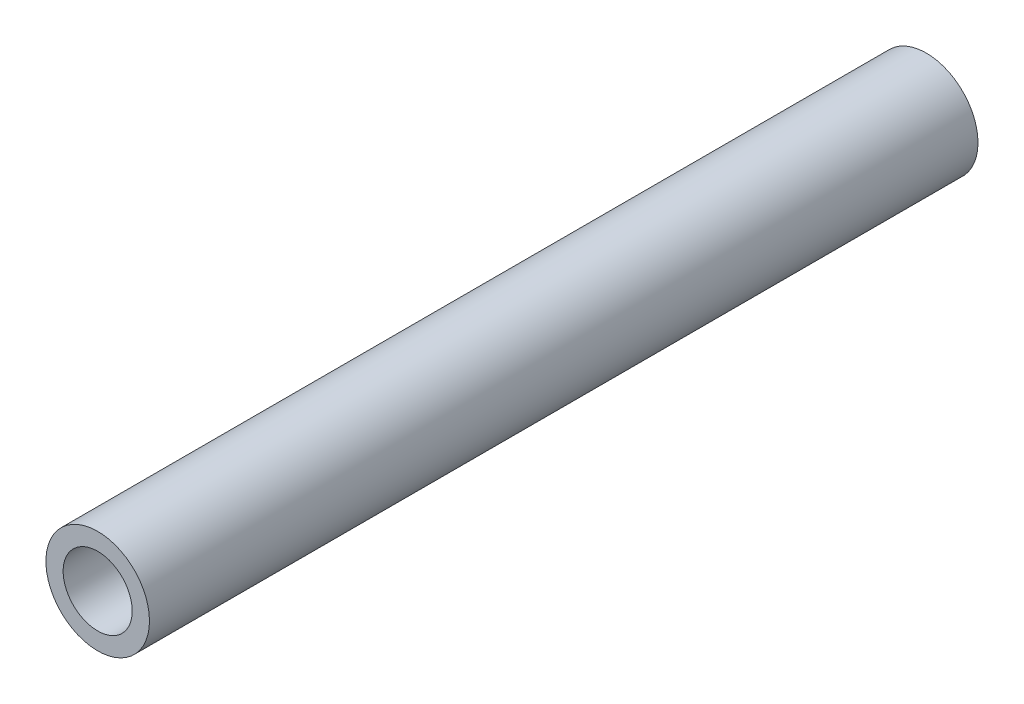
ISO-10303-21;
HEADER;
FILE_DESCRIPTION(('STEP AP214'),'2;1');
FILE_NAME('part.step','',(''),(''),'','','');
FILE_SCHEMA(('AUTOMOTIVE_DESIGN { 1 0 10303 214 1 1 1 1 }'));
ENDSEC;
DATA;
#1=APPLICATION_CONTEXT('core data for automotive mechanical design processes');
#2=APPLICATION_PROTOCOL_DEFINITION('international standard','automotive_design',2000,#1);
#3=PRODUCT_CONTEXT('',#1,'mechanical');
#4=PRODUCT('Part','Part','',(#3));
#5=PRODUCT_RELATED_PRODUCT_CATEGORY('part','',(#4));
#6=PRODUCT_DEFINITION_FORMATION('','',#4);
#7=PRODUCT_DEFINITION_CONTEXT('part definition',#1,'design');
#8=PRODUCT_DEFINITION('design','',#6,#7);
#9=PRODUCT_DEFINITION_SHAPE('','',#8);
#10=(LENGTH_UNIT() NAMED_UNIT(*) SI_UNIT(.MILLI.,.METRE.));
#11=(NAMED_UNIT(*) PLANE_ANGLE_UNIT() SI_UNIT($,.RADIAN.));
#12=(NAMED_UNIT(*) SI_UNIT($,.STERADIAN.) SOLID_ANGLE_UNIT());
#13=UNCERTAINTY_MEASURE_WITH_UNIT(LENGTH_MEASURE(1.E-05),#10,'distance_accuracy_value','');
#14=(GEOMETRIC_REPRESENTATION_CONTEXT(3) GLOBAL_UNCERTAINTY_ASSIGNED_CONTEXT((#13)) GLOBAL_UNIT_ASSIGNED_CONTEXT((#10,
#11,#12)) REPRESENTATION_CONTEXT('',''));
#15=CARTESIAN_POINT('',(0.,0.,0.));
#16=DIRECTION('',(0.,0.,1.));
#17=DIRECTION('',(1.,0.,0.));
#18=AXIS2_PLACEMENT_3D('',#15,#16,#17);
#19=CARTESIAN_POINT('',(0.,0.,96.));
#20=DIRECTION('',(0.,0.,-1.));
#21=DIRECTION('',(-1.,0.,0.));
#22=AXIS2_PLACEMENT_3D('',#19,#20,#21);
#23=CYLINDRICAL_SURFACE('',#22,6.);
#24=CARTESIAN_POINT('',(0.,0.,96.));
#25=DIRECTION('',(0.,0.,1.));
#26=DIRECTION('',(1.,0.,0.));
#27=AXIS2_PLACEMENT_3D('',#24,#25,#26);
#28=CIRCLE('',#27,6.);
#29=CARTESIAN_POINT('',(6.,0.,96.));
#30=VERTEX_POINT('',#29);
#31=EDGE_CURVE('E10',#30,#30,#28,.T.);
#32=ORIENTED_EDGE('',*,*,#31,.F.);
#33=EDGE_LOOP('',(#32));
#34=FACE_BOUND('',#33,.T.);
#35=CARTESIAN_POINT('',(0.,0.,0.));
#36=DIRECTION('',(0.,0.,1.));
#37=DIRECTION('',(1.,0.,0.));
#38=AXIS2_PLACEMENT_3D('',#35,#36,#37);
#39=CIRCLE('',#38,6.);
#40=CARTESIAN_POINT('',(6.,0.,0.));
#41=VERTEX_POINT('',#40);
#42=EDGE_CURVE('E41',#41,#41,#39,.T.);
#43=ORIENTED_EDGE('',*,*,#42,.T.);
#44=EDGE_LOOP('',(#43));
#45=FACE_BOUND('',#44,.T.);
#46=ADVANCED_FACE('F34',(#34,#45),#23,.T.);
#47=CARTESIAN_POINT('',(0.,0.,96.));
#48=DIRECTION('',(0.,0.,1.));
#49=DIRECTION('',(1.,0.,0.));
#50=AXIS2_PLACEMENT_3D('',#47,#48,#49);
#51=PLANE('',#50);
#52=CARTESIAN_POINT('',(0.,0.,96.));
#53=DIRECTION('',(0.,0.,1.));
#54=DIRECTION('',(1.,0.,0.));
#55=AXIS2_PLACEMENT_3D('',#52,#53,#54);
#56=CIRCLE('',#55,4.);
#57=CARTESIAN_POINT('',(4.,0.,96.));
#58=VERTEX_POINT('',#57);
#59=EDGE_CURVE('E47',#58,#58,#56,.T.);
#60=ORIENTED_EDGE('',*,*,#59,.F.);
#61=EDGE_LOOP('',(#60));
#62=FACE_BOUND('',#61,.T.);
#63=ORIENTED_EDGE('',*,*,#31,.T.);
#64=EDGE_LOOP('',(#63));
#65=FACE_BOUND('',#64,.T.);
#66=ADVANCED_FACE('F63',(#62,#65),#51,.T.);
#67=CARTESIAN_POINT('',(0.,0.,0.));
#68=DIRECTION('',(0.,0.,1.));
#69=DIRECTION('',(1.,0.,0.));
#70=AXIS2_PLACEMENT_3D('',#67,#68,#69);
#71=PLANE('',#70);
#72=CARTESIAN_POINT('',(0.,0.,0.));
#73=DIRECTION('',(0.,0.,1.));
#74=DIRECTION('',(1.,0.,0.));
#75=AXIS2_PLACEMENT_3D('',#72,#73,#74);
#76=CIRCLE('',#75,4.);
#77=CARTESIAN_POINT('',(4.,0.,0.));
#78=VERTEX_POINT('',#77);
#79=EDGE_CURVE('E37',#78,#78,#76,.T.);
#80=ORIENTED_EDGE('',*,*,#79,.T.);
#81=EDGE_LOOP('',(#80));
#82=FACE_BOUND('',#81,.T.);
#83=ORIENTED_EDGE('',*,*,#42,.F.);
#84=EDGE_LOOP('',(#83));
#85=FACE_BOUND('',#84,.T.);
#86=ADVANCED_FACE('F54',(#82,#85),#71,.F.);
#87=CARTESIAN_POINT('',(0.,0.,-94.));
#88=DIRECTION('',(0.,0.,1.));
#89=DIRECTION('',(1.,0.,0.));
#90=AXIS2_PLACEMENT_3D('',#87,#88,#89);
#91=CYLINDRICAL_SURFACE('',#90,4.);
#92=ORIENTED_EDGE('',*,*,#59,.T.);
#93=EDGE_LOOP('',(#92));
#94=FACE_BOUND('',#93,.T.);
#95=ORIENTED_EDGE('',*,*,#79,.F.);
#96=EDGE_LOOP('',(#95));
#97=FACE_BOUND('',#96,.T.);
#98=ADVANCED_FACE('F57',(#94,#97),#91,.F.);
#99=CLOSED_SHELL('',(#46,#66,#86,#98));
#100=MANIFOLD_SOLID_BREP('B2',#99);
#101=ADVANCED_BREP_SHAPE_REPRESENTATION('',(#18,#100),#14);
#102=SHAPE_DEFINITION_REPRESENTATION(#9,#101);
ENDSEC;
END-ISO-10303-21;
